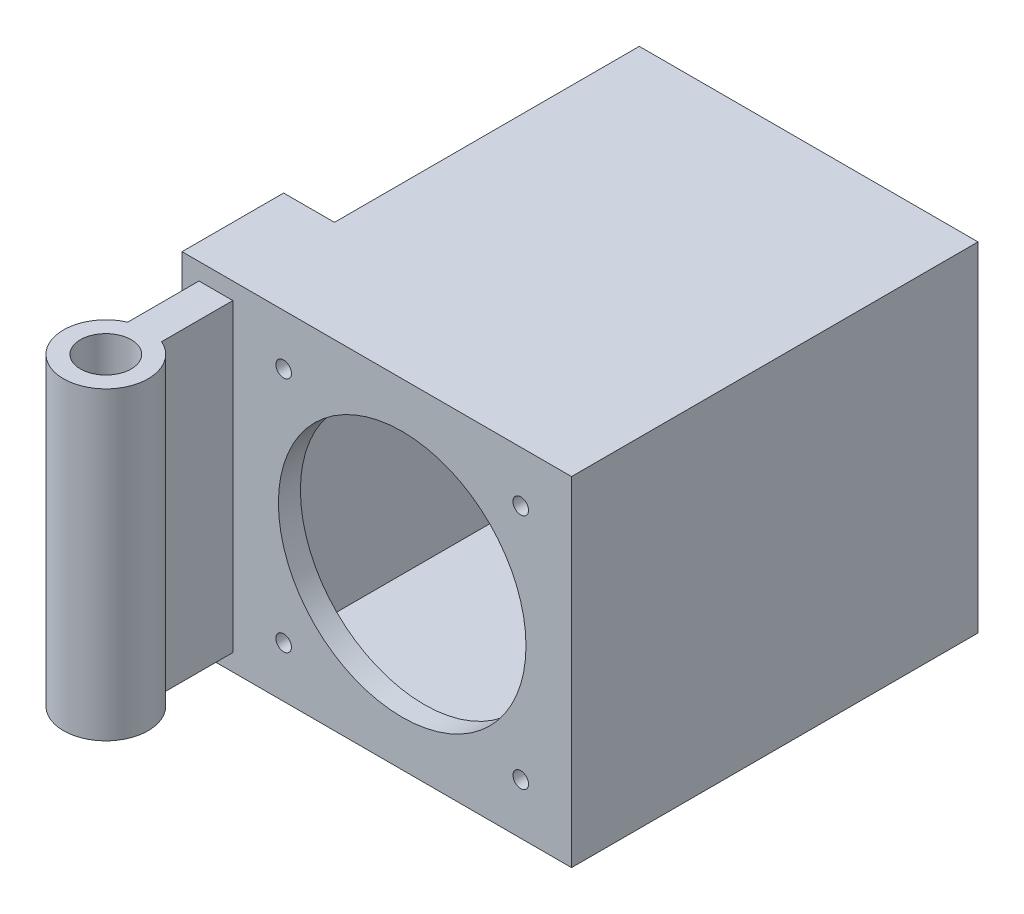
ISO-10303-21;
HEADER;
FILE_DESCRIPTION(('STEP AP214'),'2;1');
FILE_NAME('part.step','',(''),(''),'','','');
FILE_SCHEMA(('AUTOMOTIVE_DESIGN { 1 0 10303 214 1 1 1 1 }'));
ENDSEC;
DATA;
#1=APPLICATION_CONTEXT('core data for automotive mechanical design processes');
#2=APPLICATION_PROTOCOL_DEFINITION('international standard','automotive_design',2000,#1);
#3=PRODUCT_CONTEXT('',#1,'mechanical');
#4=PRODUCT('Part','Part','',(#3));
#5=PRODUCT_RELATED_PRODUCT_CATEGORY('part','',(#4));
#6=PRODUCT_DEFINITION_FORMATION('','',#4);
#7=PRODUCT_DEFINITION_CONTEXT('part definition',#1,'design');
#8=PRODUCT_DEFINITION('design','',#6,#7);
#9=PRODUCT_DEFINITION_SHAPE('','',#8);
#10=(LENGTH_UNIT() NAMED_UNIT(*) SI_UNIT(.MILLI.,.METRE.));
#11=(NAMED_UNIT(*) PLANE_ANGLE_UNIT() SI_UNIT($,.RADIAN.));
#12=(NAMED_UNIT(*) SI_UNIT($,.STERADIAN.) SOLID_ANGLE_UNIT());
#13=UNCERTAINTY_MEASURE_WITH_UNIT(LENGTH_MEASURE(1.E-05),#10,'distance_accuracy_value','');
#14=(GEOMETRIC_REPRESENTATION_CONTEXT(3) GLOBAL_UNCERTAINTY_ASSIGNED_CONTEXT((#13)) GLOBAL_UNIT_ASSIGNED_CONTEXT((#10,
#11,#12)) REPRESENTATION_CONTEXT('',''));
#15=CARTESIAN_POINT('',(0.,0.,0.));
#16=DIRECTION('',(0.,0.,1.));
#17=DIRECTION('',(1.,0.,0.));
#18=AXIS2_PLACEMENT_3D('',#15,#16,#17);
#19=CARTESIAN_POINT('',(0.,0.,60.));
#20=DIRECTION('',(0.,0.,-1.));
#21=DIRECTION('',(-1.,0.,0.));
#22=AXIS2_PLACEMENT_3D('',#19,#20,#21);
#23=PLANE('',#22);
#24=DIRECTION('',(1.,0.,0.));
#25=VECTOR('',#24,1.);
#26=CARTESIAN_POINT('',(-50.,50.,60.));
#27=LINE('',#26,#25);
#28=CARTESIAN_POINT('',(-65.,50.,60.));
#29=VERTEX_POINT('',#28);
#30=CARTESIAN_POINT('',(50.,50.,60.));
#31=VERTEX_POINT('',#30);
#32=EDGE_CURVE('E259',#29,#31,#27,.T.);
#33=ORIENTED_EDGE('',*,*,#32,.F.);
#34=DIRECTION('',(0.,1.,0.));
#35=VECTOR('',#34,1.);
#36=CARTESIAN_POINT('',(-65.,-50.,60.));
#37=LINE('',#36,#35);
#38=CARTESIAN_POINT('',(-65.,-50.,60.));
#39=VERTEX_POINT('',#38);
#40=EDGE_CURVE('E182',#39,#29,#37,.T.);
#41=ORIENTED_EDGE('',*,*,#40,.F.);
#42=DIRECTION('',(1.,0.,0.));
#43=VECTOR('',#42,1.);
#44=CARTESIAN_POINT('',(-50.,-50.,60.));
#45=LINE('',#44,#43);
#46=CARTESIAN_POINT('',(50.,-50.,60.));
#47=VERTEX_POINT('',#46);
#48=EDGE_CURVE('E265',#39,#47,#45,.T.);
#49=ORIENTED_EDGE('',*,*,#48,.T.);
#50=DIRECTION('',(0.,1.,0.));
#51=VECTOR('',#50,1.);
#52=CARTESIAN_POINT('',(50.,-50.,60.));
#53=LINE('',#52,#51);
#54=EDGE_CURVE('E262',#47,#31,#53,.T.);
#55=ORIENTED_EDGE('',*,*,#54,.T.);
#56=EDGE_LOOP('',(#33,#41,#49,#55));
#57=FACE_BOUND('',#56,.T.);
#58=CARTESIAN_POINT('',(0.,0.,60.));
#59=DIRECTION('',(0.,0.,1.));
#60=DIRECTION('',(1.,0.,0.));
#61=AXIS2_PLACEMENT_3D('',#58,#59,#60);
#62=CIRCLE('',#61,36.55);
#63=CARTESIAN_POINT('',(36.55,0.,60.));
#64=VERTEX_POINT('',#63);
#65=EDGE_CURVE('E224',#64,#64,#62,.T.);
#66=ORIENTED_EDGE('',*,*,#65,.F.);
#67=EDGE_LOOP('',(#66));
#68=FACE_BOUND('',#67,.T.);
#69=CARTESIAN_POINT('',(-35.,35.,60.));
#70=DIRECTION('',(0.,0.,1.));
#71=DIRECTION('',(1.,0.,0.));
#72=AXIS2_PLACEMENT_3D('',#69,#70,#71);
#73=CIRCLE('',#72,2.29999999999999);
#74=CARTESIAN_POINT('',(-32.7,35.,60.));
#75=VERTEX_POINT('',#74);
#76=EDGE_CURVE('E218',#75,#75,#73,.T.);
#77=ORIENTED_EDGE('',*,*,#76,.F.);
#78=EDGE_LOOP('',(#77));
#79=FACE_BOUND('',#78,.T.);
#80=CARTESIAN_POINT('',(-34.9999999999999,-35.0000000000001,60.));
#81=DIRECTION('',(0.,0.,1.));
#82=DIRECTION('',(1.,0.,0.));
#83=AXIS2_PLACEMENT_3D('',#80,#81,#82);
#84=CIRCLE('',#83,2.29999999999999);
#85=CARTESIAN_POINT('',(-32.6999999999999,-35.0000000000001,60.));
#86=VERTEX_POINT('',#85);
#87=EDGE_CURVE('E212',#86,#86,#84,.T.);
#88=ORIENTED_EDGE('',*,*,#87,.F.);
#89=EDGE_LOOP('',(#88));
#90=FACE_BOUND('',#89,.T.);
#91=CARTESIAN_POINT('',(35.,-35.,60.));
#92=DIRECTION('',(0.,0.,1.));
#93=DIRECTION('',(1.,0.,0.));
#94=AXIS2_PLACEMENT_3D('',#91,#92,#93);
#95=CIRCLE('',#94,2.29999999999999);
#96=CARTESIAN_POINT('',(37.3,-35.,60.));
#97=VERTEX_POINT('',#96);
#98=EDGE_CURVE('E206',#97,#97,#95,.T.);
#99=ORIENTED_EDGE('',*,*,#98,.F.);
#100=EDGE_LOOP('',(#99));
#101=FACE_BOUND('',#100,.T.);
#102=CARTESIAN_POINT('',(34.9999999999996,35.0000000000004,60.));
#103=DIRECTION('',(0.,0.,1.));
#104=DIRECTION('',(1.,0.,0.));
#105=AXIS2_PLACEMENT_3D('',#102,#103,#104);
#106=CIRCLE('',#105,2.29999999999999);
#107=CARTESIAN_POINT('',(37.2999999999996,35.0000000000004,60.));
#108=VERTEX_POINT('',#107);
#109=EDGE_CURVE('E200',#108,#108,#106,.T.);
#110=ORIENTED_EDGE('',*,*,#109,.F.);
#111=EDGE_LOOP('',(#110));
#112=FACE_BOUND('',#111,.T.);
#113=DIRECTION('',(0.,1.,0.));
#114=VECTOR('',#113,1.);
#115=CARTESIAN_POINT('',(-50.,-45.,60.));
#116=LINE('',#115,#114);
#117=CARTESIAN_POINT('',(-50.,-45.,60.));
#118=VERTEX_POINT('',#117);
#119=CARTESIAN_POINT('',(-50.,45.,60.));
#120=VERTEX_POINT('',#119);
#121=EDGE_CURVE('E149',#118,#120,#116,.T.);
#122=ORIENTED_EDGE('',*,*,#121,.F.);
#123=DIRECTION('',(1.,0.,0.));
#124=VECTOR('',#123,1.);
#125=CARTESIAN_POINT('',(-60.,-45.,60.));
#126=LINE('',#125,#124);
#127=CARTESIAN_POINT('',(-60.,-45.,60.));
#128=VERTEX_POINT('',#127);
#129=EDGE_CURVE('E146',#128,#118,#126,.T.);
#130=ORIENTED_EDGE('',*,*,#129,.F.);
#131=DIRECTION('',(0.,-1.,0.));
#132=VECTOR('',#131,1.);
#133=CARTESIAN_POINT('',(-60.,-45.,60.));
#134=LINE('',#133,#132);
#135=CARTESIAN_POINT('',(-60.,45.,60.));
#136=VERTEX_POINT('',#135);
#137=EDGE_CURVE('E60',#136,#128,#134,.T.);
#138=ORIENTED_EDGE('',*,*,#137,.F.);
#139=DIRECTION('',(-1.,0.,0.));
#140=VECTOR('',#139,1.);
#141=CARTESIAN_POINT('',(-60.,45.,60.));
#142=LINE('',#141,#140);
#143=EDGE_CURVE('E55',#120,#136,#142,.T.);
#144=ORIENTED_EDGE('',*,*,#143,.F.);
#145=EDGE_LOOP('',(#122,#130,#138,#144));
#146=FACE_BOUND('',#145,.T.);
#147=ADVANCED_FACE('F38',(#57,#68,#79,#90,#101,#112,#146),#23,.F.);
#148=CARTESIAN_POINT('',(0.,0.,53.5));
#149=DIRECTION('',(0.,0.,-1.));
#150=DIRECTION('',(-1.,0.,0.));
#151=AXIS2_PLACEMENT_3D('',#148,#149,#150);
#152=PLANE('',#151);
#153=CARTESIAN_POINT('',(34.9999999999996,35.0000000000004,53.5));
#154=DIRECTION('',(0.,0.,-1.));
#155=DIRECTION('',(-1.,0.,0.));
#156=AXIS2_PLACEMENT_3D('',#153,#154,#155);
#157=CIRCLE('',#156,2.29999999999999);
#158=CARTESIAN_POINT('',(32.6999999999996,35.0000000000004,53.5));
#159=VERTEX_POINT('',#158);
#160=EDGE_CURVE('E203',#159,#159,#157,.F.);
#161=ORIENTED_EDGE('',*,*,#160,.T.);
#162=EDGE_LOOP('',(#161));
#163=FACE_BOUND('',#162,.T.);
#164=CARTESIAN_POINT('',(-34.9999999999999,-35.0000000000001,53.5));
#165=DIRECTION('',(0.,0.,-1.));
#166=DIRECTION('',(-1.,0.,0.));
#167=AXIS2_PLACEMENT_3D('',#164,#165,#166);
#168=CIRCLE('',#167,2.29999999999999);
#169=CARTESIAN_POINT('',(-37.2999999999999,-35.0000000000001,53.5));
#170=VERTEX_POINT('',#169);
#171=EDGE_CURVE('E215',#170,#170,#168,.F.);
#172=ORIENTED_EDGE('',*,*,#171,.T.);
#173=EDGE_LOOP('',(#172));
#174=FACE_BOUND('',#173,.T.);
#175=DIRECTION('',(0.,-1.,0.));
#176=VECTOR('',#175,1.);
#177=CARTESIAN_POINT('',(-43.5,-43.5,53.5));
#178=LINE('',#177,#176);
#179=CARTESIAN_POINT('',(-43.5,43.5,53.5));
#180=VERTEX_POINT('',#179);
#181=CARTESIAN_POINT('',(-43.5,-43.5,53.5));
#182=VERTEX_POINT('',#181);
#183=EDGE_CURVE('E236',#180,#182,#178,.T.);
#184=ORIENTED_EDGE('',*,*,#183,.F.);
#185=DIRECTION('',(-1.,0.,0.));
#186=VECTOR('',#185,1.);
#187=CARTESIAN_POINT('',(43.5,43.5,53.5));
#188=LINE('',#187,#186);
#189=CARTESIAN_POINT('',(43.5,43.5,53.5));
#190=VERTEX_POINT('',#189);
#191=EDGE_CURVE('E238',#190,#180,#188,.T.);
#192=ORIENTED_EDGE('',*,*,#191,.F.);
#193=DIRECTION('',(0.,1.,0.));
#194=VECTOR('',#193,1.);
#195=CARTESIAN_POINT('',(43.5,-43.5,53.5));
#196=LINE('',#195,#194);
#197=CARTESIAN_POINT('',(43.5,-43.5,53.5));
#198=VERTEX_POINT('',#197);
#199=EDGE_CURVE('E231',#198,#190,#196,.T.);
#200=ORIENTED_EDGE('',*,*,#199,.F.);
#201=DIRECTION('',(1.,0.,0.));
#202=VECTOR('',#201,1.);
#203=CARTESIAN_POINT('',(43.5,-43.5,53.5));
#204=LINE('',#203,#202);
#205=EDGE_CURVE('E233',#182,#198,#204,.T.);
#206=ORIENTED_EDGE('',*,*,#205,.F.);
#207=EDGE_LOOP('',(#184,#192,#200,#206));
#208=FACE_BOUND('',#207,.T.);
#209=CARTESIAN_POINT('',(0.,0.,53.5));
#210=DIRECTION('',(0.,0.,-1.));
#211=DIRECTION('',(-1.,0.,0.));
#212=AXIS2_PLACEMENT_3D('',#209,#210,#211);
#213=CIRCLE('',#212,36.55);
#214=CARTESIAN_POINT('',(-36.55,0.,53.5));
#215=VERTEX_POINT('',#214);
#216=EDGE_CURVE('E227',#215,#215,#213,.F.);
#217=ORIENTED_EDGE('',*,*,#216,.T.);
#218=EDGE_LOOP('',(#217));
#219=FACE_BOUND('',#218,.T.);
#220=CARTESIAN_POINT('',(-35.,35.,53.5));
#221=DIRECTION('',(0.,0.,-1.));
#222=DIRECTION('',(-1.,0.,0.));
#223=AXIS2_PLACEMENT_3D('',#220,#221,#222);
#224=CIRCLE('',#223,2.29999999999999);
#225=CARTESIAN_POINT('',(-37.3,35.,53.5));
#226=VERTEX_POINT('',#225);
#227=EDGE_CURVE('E221',#226,#226,#224,.F.);
#228=ORIENTED_EDGE('',*,*,#227,.T.);
#229=EDGE_LOOP('',(#228));
#230=FACE_BOUND('',#229,.T.);
#231=CARTESIAN_POINT('',(35.,-35.,53.5));
#232=DIRECTION('',(0.,0.,-1.));
#233=DIRECTION('',(-1.,0.,0.));
#234=AXIS2_PLACEMENT_3D('',#231,#232,#233);
#235=CIRCLE('',#234,2.29999999999999);
#236=CARTESIAN_POINT('',(32.7,-35.,53.5));
#237=VERTEX_POINT('',#236);
#238=EDGE_CURVE('E209',#237,#237,#235,.F.);
#239=ORIENTED_EDGE('',*,*,#238,.T.);
#240=EDGE_LOOP('',(#239));
#241=FACE_BOUND('',#240,.T.);
#242=ADVANCED_FACE('F319',(#163,#174,#208,#219,#230,#241),#152,.T.);
#243=CARTESIAN_POINT('',(-50.,-50.,60.));
#244=DIRECTION('',(-1.,0.,0.));
#245=DIRECTION('',(0.,0.,1.));
#246=AXIS2_PLACEMENT_3D('',#243,#244,#245);
#247=PLANE('',#246);
#248=DIRECTION('',(0.,-1.,0.));
#249=VECTOR('',#248,1.);
#250=CARTESIAN_POINT('',(-50.,-50.,30.));
#251=LINE('',#250,#249);
#252=CARTESIAN_POINT('',(-50.,50.,30.));
#253=VERTEX_POINT('',#252);
#254=CARTESIAN_POINT('',(-50.,-50.,30.));
#255=VERTEX_POINT('',#254);
#256=EDGE_CURVE('E179',#253,#255,#251,.T.);
#257=ORIENTED_EDGE('',*,*,#256,.F.);
#258=DIRECTION('',(0.,0.,-1.));
#259=VECTOR('',#258,1.);
#260=CARTESIAN_POINT('',(-50.,50.,60.));
#261=LINE('',#260,#259);
#262=CARTESIAN_POINT('',(-50.,50.,-60.));
#263=VERTEX_POINT('',#262);
#264=EDGE_CURVE('E42',#253,#263,#261,.T.);
#265=ORIENTED_EDGE('',*,*,#264,.T.);
#266=DIRECTION('',(0.,1.,0.));
#267=VECTOR('',#266,1.);
#268=CARTESIAN_POINT('',(-50.,-50.,-60.));
#269=LINE('',#268,#267);
#270=CARTESIAN_POINT('',(-50.,-50.,-60.));
#271=VERTEX_POINT('',#270);
#272=EDGE_CURVE('E258',#271,#263,#269,.T.);
#273=ORIENTED_EDGE('',*,*,#272,.F.);
#274=DIRECTION('',(0.,0.,-1.));
#275=VECTOR('',#274,1.);
#276=CARTESIAN_POINT('',(-50.,-50.,60.));
#277=LINE('',#276,#275);
#278=EDGE_CURVE('E12',#255,#271,#277,.T.);
#279=ORIENTED_EDGE('',*,*,#278,.F.);
#280=EDGE_LOOP('',(#257,#265,#273,#279));
#281=FACE_BOUND('',#280,.T.);
#282=ADVANCED_FACE('F40',(#281),#247,.T.);
#283=CARTESIAN_POINT('',(-50.,-50.,60.));
#284=DIRECTION('',(0.,1.,0.));
#285=DIRECTION('',(0.,0.,1.));
#286=AXIS2_PLACEMENT_3D('',#283,#284,#285);
#287=PLANE('',#286);
#288=DIRECTION('',(1.,0.,0.));
#289=VECTOR('',#288,1.);
#290=CARTESIAN_POINT('',(-50.,-50.,-60.));
#291=LINE('',#290,#289);
#292=CARTESIAN_POINT('',(50.,-50.,-60.));
#293=VERTEX_POINT('',#292);
#294=EDGE_CURVE('E263',#271,#293,#291,.T.);
#295=ORIENTED_EDGE('',*,*,#294,.T.);
#296=DIRECTION('',(0.,0.,-1.));
#297=VECTOR('',#296,1.);
#298=CARTESIAN_POINT('',(50.,-50.,60.));
#299=LINE('',#298,#297);
#300=EDGE_CURVE('E47',#47,#293,#299,.T.);
#301=ORIENTED_EDGE('',*,*,#300,.F.);
#302=ORIENTED_EDGE('',*,*,#48,.F.);
#303=DIRECTION('',(0.,0.,1.));
#304=VECTOR('',#303,1.);
#305=CARTESIAN_POINT('',(-65.,-50.,30.));
#306=LINE('',#305,#304);
#307=CARTESIAN_POINT('',(-65.,-50.,30.));
#308=VERTEX_POINT('',#307);
#309=EDGE_CURVE('E189',#308,#39,#306,.T.);
#310=ORIENTED_EDGE('',*,*,#309,.F.);
#311=DIRECTION('',(1.,0.,0.));
#312=VECTOR('',#311,1.);
#313=CARTESIAN_POINT('',(-65.,-50.,30.));
#314=LINE('',#313,#312);
#315=EDGE_CURVE('E192',#308,#255,#314,.T.);
#316=ORIENTED_EDGE('',*,*,#315,.T.);
#317=ORIENTED_EDGE('',*,*,#278,.T.);
#318=EDGE_LOOP('',(#295,#301,#302,#310,#316,#317));
#319=FACE_BOUND('',#318,.T.);
#320=ADVANCED_FACE('F292',(#319),#287,.F.);
#321=CARTESIAN_POINT('',(50.,-50.,60.));
#322=DIRECTION('',(-1.,0.,0.));
#323=DIRECTION('',(0.,0.,1.));
#324=AXIS2_PLACEMENT_3D('',#321,#322,#323);
#325=PLANE('',#324);
#326=DIRECTION('',(0.,1.,0.));
#327=VECTOR('',#326,1.);
#328=CARTESIAN_POINT('',(50.,-50.,-60.));
#329=LINE('',#328,#327);
#330=CARTESIAN_POINT('',(50.,50.,-60.));
#331=VERTEX_POINT('',#330);
#332=EDGE_CURVE('E272',#293,#331,#329,.T.);
#333=ORIENTED_EDGE('',*,*,#332,.T.);
#334=DIRECTION('',(0.,0.,-1.));
#335=VECTOR('',#334,1.);
#336=CARTESIAN_POINT('',(50.,50.,60.));
#337=LINE('',#336,#335);
#338=EDGE_CURVE('E277',#31,#331,#337,.T.);
#339=ORIENTED_EDGE('',*,*,#338,.F.);
#340=ORIENTED_EDGE('',*,*,#54,.F.);
#341=ORIENTED_EDGE('',*,*,#300,.T.);
#342=EDGE_LOOP('',(#333,#339,#340,#341));
#343=FACE_BOUND('',#342,.T.);
#344=ADVANCED_FACE('F295',(#343),#325,.F.);
#345=CARTESIAN_POINT('',(-50.,50.,60.));
#346=DIRECTION('',(0.,1.,0.));
#347=DIRECTION('',(0.,0.,1.));
#348=AXIS2_PLACEMENT_3D('',#345,#346,#347);
#349=PLANE('',#348);
#350=DIRECTION('',(1.,0.,0.));
#351=VECTOR('',#350,1.);
#352=CARTESIAN_POINT('',(-50.,50.,-60.));
#353=LINE('',#352,#351);
#354=EDGE_CURVE('E269',#263,#331,#353,.T.);
#355=ORIENTED_EDGE('',*,*,#354,.F.);
#356=ORIENTED_EDGE('',*,*,#264,.F.);
#357=DIRECTION('',(1.,0.,0.));
#358=VECTOR('',#357,1.);
#359=CARTESIAN_POINT('',(-65.,50.,30.));
#360=LINE('',#359,#358);
#361=CARTESIAN_POINT('',(-65.,50.,30.));
#362=VERTEX_POINT('',#361);
#363=EDGE_CURVE('E197',#362,#253,#360,.T.);
#364=ORIENTED_EDGE('',*,*,#363,.F.);
#365=DIRECTION('',(0.,0.,-1.));
#366=VECTOR('',#365,1.);
#367=CARTESIAN_POINT('',(-65.,50.,30.));
#368=LINE('',#367,#366);
#369=EDGE_CURVE('E185',#29,#362,#368,.T.);
#370=ORIENTED_EDGE('',*,*,#369,.F.);
#371=ORIENTED_EDGE('',*,*,#32,.T.);
#372=ORIENTED_EDGE('',*,*,#338,.T.);
#373=EDGE_LOOP('',(#355,#356,#364,#370,#371,#372));
#374=FACE_BOUND('',#373,.T.);
#375=ADVANCED_FACE('F285',(#374),#349,.T.);
#376=CARTESIAN_POINT('',(0.,0.,-60.));
#377=DIRECTION('',(0.,0.,-1.));
#378=DIRECTION('',(-1.,0.,0.));
#379=AXIS2_PLACEMENT_3D('',#376,#377,#378);
#380=PLANE('',#379);
#381=DIRECTION('',(0.,1.,0.));
#382=VECTOR('',#381,1.);
#383=CARTESIAN_POINT('',(-43.5,-43.5,-60.));
#384=LINE('',#383,#382);
#385=CARTESIAN_POINT('',(-43.5,-43.5,-60.));
#386=VERTEX_POINT('',#385);
#387=CARTESIAN_POINT('',(-43.5,43.5,-60.));
#388=VERTEX_POINT('',#387);
#389=EDGE_CURVE('E230',#386,#388,#384,.T.);
#390=ORIENTED_EDGE('',*,*,#389,.F.);
#391=DIRECTION('',(-1.,0.,0.));
#392=VECTOR('',#391,1.);
#393=CARTESIAN_POINT('',(43.5,-43.5,-60.));
#394=LINE('',#393,#392);
#395=CARTESIAN_POINT('',(43.5,-43.5,-60.));
#396=VERTEX_POINT('',#395);
#397=EDGE_CURVE('E246',#396,#386,#394,.T.);
#398=ORIENTED_EDGE('',*,*,#397,.F.);
#399=DIRECTION('',(0.,-1.,0.));
#400=VECTOR('',#399,1.);
#401=CARTESIAN_POINT('',(43.5,-43.5,-60.));
#402=LINE('',#401,#400);
#403=CARTESIAN_POINT('',(43.5,43.5,-60.));
#404=VERTEX_POINT('',#403);
#405=EDGE_CURVE('E243',#404,#396,#402,.T.);
#406=ORIENTED_EDGE('',*,*,#405,.F.);
#407=DIRECTION('',(1.,0.,0.));
#408=VECTOR('',#407,1.);
#409=CARTESIAN_POINT('',(43.5,43.5,-60.));
#410=LINE('',#409,#408);
#411=EDGE_CURVE('E240',#388,#404,#410,.T.);
#412=ORIENTED_EDGE('',*,*,#411,.F.);
#413=EDGE_LOOP('',(#390,#398,#406,#412));
#414=FACE_BOUND('',#413,.T.);
#415=ORIENTED_EDGE('',*,*,#272,.T.);
#416=ORIENTED_EDGE('',*,*,#354,.T.);
#417=ORIENTED_EDGE('',*,*,#332,.F.);
#418=ORIENTED_EDGE('',*,*,#294,.F.);
#419=EDGE_LOOP('',(#415,#416,#417,#418));
#420=FACE_BOUND('',#419,.T.);
#421=ADVANCED_FACE('F289',(#414,#420),#380,.T.);
#422=CARTESIAN_POINT('',(-43.5,-43.5,183.036579926459));
#423=DIRECTION('',(-1.,0.,0.));
#424=DIRECTION('',(0.,0.,1.));
#425=AXIS2_PLACEMENT_3D('',#422,#423,#424);
#426=PLANE('',#425);
#427=ORIENTED_EDGE('',*,*,#183,.T.);
#428=DIRECTION('',(0.,0.,-1.));
#429=VECTOR('',#428,1.);
#430=CARTESIAN_POINT('',(-43.5,-43.5,183.036579926459));
#431=LINE('',#430,#429);
#432=EDGE_CURVE('E234',#182,#386,#431,.T.);
#433=ORIENTED_EDGE('',*,*,#432,.T.);
#434=ORIENTED_EDGE('',*,*,#389,.T.);
#435=DIRECTION('',(0.,0.,-1.));
#436=VECTOR('',#435,1.);
#437=CARTESIAN_POINT('',(-43.5,43.5,183.036579926459));
#438=LINE('',#437,#436);
#439=EDGE_CURVE('E249',#180,#388,#438,.T.);
#440=ORIENTED_EDGE('',*,*,#439,.F.);
#441=EDGE_LOOP('',(#427,#433,#434,#440));
#442=FACE_BOUND('',#441,.T.);
#443=ADVANCED_FACE('F328',(#442),#426,.F.);
#444=CARTESIAN_POINT('',(43.5,-43.5,183.036579926459));
#445=DIRECTION('',(0.,-1.,0.));
#446=DIRECTION('',(0.,0.,-1.));
#447=AXIS2_PLACEMENT_3D('',#444,#445,#446);
#448=PLANE('',#447);
#449=ORIENTED_EDGE('',*,*,#205,.T.);
#450=DIRECTION('',(0.,0.,-1.));
#451=VECTOR('',#450,1.);
#452=CARTESIAN_POINT('',(43.5,-43.5,183.036579926459));
#453=LINE('',#452,#451);
#454=EDGE_CURVE('E251',#198,#396,#453,.T.);
#455=ORIENTED_EDGE('',*,*,#454,.T.);
#456=ORIENTED_EDGE('',*,*,#397,.T.);
#457=ORIENTED_EDGE('',*,*,#432,.F.);
#458=EDGE_LOOP('',(#449,#455,#456,#457));
#459=FACE_BOUND('',#458,.T.);
#460=ADVANCED_FACE('F352',(#459),#448,.F.);
#461=CARTESIAN_POINT('',(43.5,-43.5,183.036579926459));
#462=DIRECTION('',(1.,0.,0.));
#463=DIRECTION('',(0.,0.,-1.));
#464=AXIS2_PLACEMENT_3D('',#461,#462,#463);
#465=PLANE('',#464);
#466=ORIENTED_EDGE('',*,*,#199,.T.);
#467=DIRECTION('',(0.,0.,-1.));
#468=VECTOR('',#467,1.);
#469=CARTESIAN_POINT('',(43.5,43.5,183.036579926459));
#470=LINE('',#469,#468);
#471=EDGE_CURVE('E253',#190,#404,#470,.T.);
#472=ORIENTED_EDGE('',*,*,#471,.T.);
#473=ORIENTED_EDGE('',*,*,#405,.T.);
#474=ORIENTED_EDGE('',*,*,#454,.F.);
#475=EDGE_LOOP('',(#466,#472,#473,#474));
#476=FACE_BOUND('',#475,.T.);
#477=ADVANCED_FACE('F359',(#476),#465,.F.);
#478=CARTESIAN_POINT('',(43.5,43.5,183.036579926459));
#479=DIRECTION('',(0.,1.,0.));
#480=DIRECTION('',(0.,0.,1.));
#481=AXIS2_PLACEMENT_3D('',#478,#479,#480);
#482=PLANE('',#481);
#483=ORIENTED_EDGE('',*,*,#191,.T.);
#484=ORIENTED_EDGE('',*,*,#439,.T.);
#485=ORIENTED_EDGE('',*,*,#411,.T.);
#486=ORIENTED_EDGE('',*,*,#471,.F.);
#487=EDGE_LOOP('',(#483,#484,#485,#486));
#488=FACE_BOUND('',#487,.T.);
#489=ADVANCED_FACE('F367',(#488),#482,.F.);
#490=CARTESIAN_POINT('',(0.,0.,-49.8790114094732));
#491=DIRECTION('',(0.,0.,1.));
#492=DIRECTION('',(1.,0.,0.));
#493=AXIS2_PLACEMENT_3D('',#490,#491,#492);
#494=CYLINDRICAL_SURFACE('',#493,36.55);
#495=ORIENTED_EDGE('',*,*,#65,.T.);
#496=EDGE_LOOP('',(#495));
#497=FACE_BOUND('',#496,.T.);
#498=ORIENTED_EDGE('',*,*,#216,.F.);
#499=EDGE_LOOP('',(#498));
#500=FACE_BOUND('',#499,.T.);
#501=ADVANCED_FACE('F375',(#497,#500),#494,.F.);
#502=CARTESIAN_POINT('',(-35.,35.,60.));
#503=DIRECTION('',(0.,0.,1.));
#504=DIRECTION('',(1.,0.,0.));
#505=AXIS2_PLACEMENT_3D('',#502,#503,#504);
#506=CYLINDRICAL_SURFACE('',#505,2.29999999999999);
#507=ORIENTED_EDGE('',*,*,#227,.F.);
#508=EDGE_LOOP('',(#507));
#509=FACE_BOUND('',#508,.T.);
#510=ORIENTED_EDGE('',*,*,#76,.T.);
#511=EDGE_LOOP('',(#510));
#512=FACE_BOUND('',#511,.T.);
#513=ADVANCED_FACE('F382',(#509,#512),#506,.F.);
#514=CARTESIAN_POINT('',(-34.9999999999999,-35.0000000000001,60.));
#515=DIRECTION('',(0.,0.,1.));
#516=DIRECTION('',(1.,0.,0.));
#517=AXIS2_PLACEMENT_3D('',#514,#515,#516);
#518=CYLINDRICAL_SURFACE('',#517,2.29999999999999);
#519=ORIENTED_EDGE('',*,*,#171,.F.);
#520=EDGE_LOOP('',(#519));
#521=FACE_BOUND('',#520,.T.);
#522=ORIENTED_EDGE('',*,*,#87,.T.);
#523=EDGE_LOOP('',(#522));
#524=FACE_BOUND('',#523,.T.);
#525=ADVANCED_FACE('F390',(#521,#524),#518,.F.);
#526=CARTESIAN_POINT('',(35.,-35.,60.));
#527=DIRECTION('',(0.,0.,1.));
#528=DIRECTION('',(1.,0.,0.));
#529=AXIS2_PLACEMENT_3D('',#526,#527,#528);
#530=CYLINDRICAL_SURFACE('',#529,2.29999999999999);
#531=ORIENTED_EDGE('',*,*,#238,.F.);
#532=EDGE_LOOP('',(#531));
#533=FACE_BOUND('',#532,.T.);
#534=ORIENTED_EDGE('',*,*,#98,.T.);
#535=EDGE_LOOP('',(#534));
#536=FACE_BOUND('',#535,.T.);
#537=ADVANCED_FACE('F315',(#533,#536),#530,.F.);
#538=CARTESIAN_POINT('',(34.9999999999996,35.0000000000004,60.));
#539=DIRECTION('',(0.,0.,1.));
#540=DIRECTION('',(1.,0.,0.));
#541=AXIS2_PLACEMENT_3D('',#538,#539,#540);
#542=CYLINDRICAL_SURFACE('',#541,2.29999999999999);
#543=ORIENTED_EDGE('',*,*,#160,.F.);
#544=EDGE_LOOP('',(#543));
#545=FACE_BOUND('',#544,.T.);
#546=ORIENTED_EDGE('',*,*,#109,.T.);
#547=EDGE_LOOP('',(#546));
#548=FACE_BOUND('',#547,.T.);
#549=ADVANCED_FACE('F308',(#545,#548),#542,.F.);
#550=CARTESIAN_POINT('',(-65.,-50.,30.));
#551=DIRECTION('',(0.,0.,1.));
#552=DIRECTION('',(1.,0.,0.));
#553=AXIS2_PLACEMENT_3D('',#550,#551,#552);
#554=PLANE('',#553);
#555=ORIENTED_EDGE('',*,*,#256,.T.);
#556=ORIENTED_EDGE('',*,*,#315,.F.);
#557=DIRECTION('',(0.,-1.,0.));
#558=VECTOR('',#557,1.);
#559=CARTESIAN_POINT('',(-65.,-50.,30.));
#560=LINE('',#559,#558);
#561=EDGE_CURVE('E187',#362,#308,#560,.T.);
#562=ORIENTED_EDGE('',*,*,#561,.F.);
#563=ORIENTED_EDGE('',*,*,#363,.T.);
#564=EDGE_LOOP('',(#555,#556,#562,#563));
#565=FACE_BOUND('',#564,.T.);
#566=ADVANCED_FACE('F306',(#565),#554,.F.);
#567=CARTESIAN_POINT('',(-65.,0.,0.));
#568=DIRECTION('',(1.,0.,0.));
#569=DIRECTION('',(0.,0.,-1.));
#570=AXIS2_PLACEMENT_3D('',#567,#568,#569);
#571=PLANE('',#570);
#572=ORIENTED_EDGE('',*,*,#40,.T.);
#573=ORIENTED_EDGE('',*,*,#369,.T.);
#574=ORIENTED_EDGE('',*,*,#561,.T.);
#575=ORIENTED_EDGE('',*,*,#309,.T.);
#576=EDGE_LOOP('',(#572,#573,#574,#575));
#577=FACE_BOUND('',#576,.T.);
#578=ADVANCED_FACE('F302',(#577),#571,.F.);
#579=CARTESIAN_POINT('',(-50.,-45.,105.001));
#580=DIRECTION('',(-1.,0.,0.));
#581=DIRECTION('',(0.,0.,1.));
#582=AXIS2_PLACEMENT_3D('',#579,#580,#581);
#583=PLANE('',#582);
#584=DIRECTION('',(0.,-1.,0.));
#585=VECTOR('',#584,1.);
#586=CARTESIAN_POINT('',(-50.,85.3553390593274,81.0435607626104));
#587=LINE('',#586,#585);
#588=CARTESIAN_POINT('',(-50.,-45.,81.0435607626104));
#589=VERTEX_POINT('',#588);
#590=CARTESIAN_POINT('',(-50.,45.,81.0435607626104));
#591=VERTEX_POINT('',#590);
#592=EDGE_CURVE('E153',#589,#591,#587,.F.);
#593=ORIENTED_EDGE('',*,*,#592,.F.);
#594=DIRECTION('',(0.,0.,-1.));
#595=VECTOR('',#594,1.);
#596=CARTESIAN_POINT('',(-50.,-45.,105.001));
#597=LINE('',#596,#595);
#598=EDGE_CURVE('E140',#589,#118,#597,.T.);
#599=ORIENTED_EDGE('',*,*,#598,.T.);
#600=ORIENTED_EDGE('',*,*,#121,.T.);
#601=DIRECTION('',(0.,0.,-1.));
#602=VECTOR('',#601,1.);
#603=CARTESIAN_POINT('',(-50.,45.,105.001));
#604=LINE('',#603,#602);
#605=EDGE_CURVE('E155',#591,#120,#604,.T.);
#606=ORIENTED_EDGE('',*,*,#605,.F.);
#607=EDGE_LOOP('',(#593,#599,#600,#606));
#608=FACE_BOUND('',#607,.T.);
#609=ADVANCED_FACE('F154',(#608),#583,.F.);
#610=CARTESIAN_POINT('',(-60.,45.,105.001));
#611=DIRECTION('',(0.,-1.,0.));
#612=DIRECTION('',(0.,0.,-1.));
#613=AXIS2_PLACEMENT_3D('',#610,#611,#612);
#614=PLANE('',#613);
#615=CARTESIAN_POINT('',(-55.,45.,92.5));
#616=DIRECTION('',(0.,1.,0.));
#617=DIRECTION('',(0.,0.,1.));
#618=AXIS2_PLACEMENT_3D('',#615,#616,#617);
#619=CIRCLE('',#618,7.5);
#620=CARTESIAN_POINT('',(-55.,45.,100.));
#621=VERTEX_POINT('',#620);
#622=EDGE_CURVE('E167',#621,#621,#619,.T.);
#623=ORIENTED_EDGE('',*,*,#622,.F.);
#624=EDGE_LOOP('',(#623));
#625=FACE_BOUND('',#624,.T.);
#626=DIRECTION('',(0.,0.,-1.));
#627=VECTOR('',#626,1.);
#628=CARTESIAN_POINT('',(-60.,45.,105.001));
#629=LINE('',#628,#627);
#630=CARTESIAN_POINT('',(-60.,45.,81.0435607626104));
#631=VERTEX_POINT('',#630);
#632=EDGE_CURVE('E174',#631,#136,#629,.T.);
#633=ORIENTED_EDGE('',*,*,#632,.F.);
#634=CARTESIAN_POINT('',(-55.,45.,92.5));
#635=DIRECTION('',(0.,1.,0.));
#636=DIRECTION('',(0.,0.,1.));
#637=AXIS2_PLACEMENT_3D('',#634,#635,#636);
#638=CIRCLE('',#637,12.5);
#639=EDGE_CURVE('E150',#631,#591,#638,.T.);
#640=ORIENTED_EDGE('',*,*,#639,.T.);
#641=ORIENTED_EDGE('',*,*,#605,.T.);
#642=ORIENTED_EDGE('',*,*,#143,.T.);
#643=EDGE_LOOP('',(#633,#640,#641,#642));
#644=FACE_BOUND('',#643,.T.);
#645=ADVANCED_FACE('F477',(#625,#644),#614,.F.);
#646=CARTESIAN_POINT('',(-60.,-45.,105.001));
#647=DIRECTION('',(1.,0.,0.));
#648=DIRECTION('',(0.,0.,-1.));
#649=AXIS2_PLACEMENT_3D('',#646,#647,#648);
#650=PLANE('',#649);
#651=DIRECTION('',(0.,-1.,0.));
#652=VECTOR('',#651,1.);
#653=CARTESIAN_POINT('',(-60.,85.3553390593274,81.0435607626104));
#654=LINE('',#653,#652);
#655=CARTESIAN_POINT('',(-60.,-45.,81.0435607626104));
#656=VERTEX_POINT('',#655);
#657=EDGE_CURVE('E159',#631,#656,#654,.T.);
#658=ORIENTED_EDGE('',*,*,#657,.F.);
#659=ORIENTED_EDGE('',*,*,#632,.T.);
#660=ORIENTED_EDGE('',*,*,#137,.T.);
#661=DIRECTION('',(0.,0.,-1.));
#662=VECTOR('',#661,1.);
#663=CARTESIAN_POINT('',(-60.,-45.,105.001));
#664=LINE('',#663,#662);
#665=EDGE_CURVE('E172',#656,#128,#664,.T.);
#666=ORIENTED_EDGE('',*,*,#665,.F.);
#667=EDGE_LOOP('',(#658,#659,#660,#666));
#668=FACE_BOUND('',#667,.T.);
#669=ADVANCED_FACE('F470',(#668),#650,.F.);
#670=CARTESIAN_POINT('',(-60.,-45.,105.001));
#671=DIRECTION('',(0.,1.,0.));
#672=DIRECTION('',(0.,0.,1.));
#673=AXIS2_PLACEMENT_3D('',#670,#671,#672);
#674=PLANE('',#673);
#675=CARTESIAN_POINT('',(-55.,-45.,92.5));
#676=DIRECTION('',(0.,1.,0.));
#677=DIRECTION('',(0.,0.,1.));
#678=AXIS2_PLACEMENT_3D('',#675,#676,#677);
#679=CIRCLE('',#678,7.5);
#680=CARTESIAN_POINT('',(-55.,-45.,100.));
#681=VERTEX_POINT('',#680);
#682=EDGE_CURVE('E163',#681,#681,#679,.F.);
#683=ORIENTED_EDGE('',*,*,#682,.F.);
#684=EDGE_LOOP('',(#683));
#685=FACE_BOUND('',#684,.T.);
#686=ORIENTED_EDGE('',*,*,#598,.F.);
#687=CARTESIAN_POINT('',(-55.,-45.,92.5));
#688=DIRECTION('',(0.,1.,0.));
#689=DIRECTION('',(0.,0.,1.));
#690=AXIS2_PLACEMENT_3D('',#687,#688,#689);
#691=CIRCLE('',#690,12.5);
#692=EDGE_CURVE('E145',#589,#656,#691,.F.);
#693=ORIENTED_EDGE('',*,*,#692,.T.);
#694=ORIENTED_EDGE('',*,*,#665,.T.);
#695=ORIENTED_EDGE('',*,*,#129,.T.);
#696=EDGE_LOOP('',(#686,#693,#694,#695));
#697=FACE_BOUND('',#696,.T.);
#698=ADVANCED_FACE('F142',(#685,#697),#674,.F.);
#699=CARTESIAN_POINT('',(-55.,85.3553390593274,92.5));
#700=DIRECTION('',(0.,-1.,0.));
#701=DIRECTION('',(0.,0.,-1.));
#702=AXIS2_PLACEMENT_3D('',#699,#700,#701);
#703=CYLINDRICAL_SURFACE('',#702,12.5);
#704=CARTESIAN_POINT('',(-67.2958326273579,0.,90.25));
#705=CARTESIAN_POINT('',(-67.2958350001104,-0.125280146269779,90.2500048960605));
#706=CARTESIAN_POINT('',(-67.2977680912784,-0.250624910173669,90.2604988868153));
#707=CARTESIAN_POINT('',(-67.3052829316915,-0.497786545180764,90.3021730510429));
#708=CARTESIAN_POINT('',(-67.310867876518,-0.619600228799288,90.333371342324));
#709=CARTESIAN_POINT('',(-67.3250338550568,-0.856087450196495,90.41547047514));
#710=CARTESIAN_POINT('',(-67.3336122044945,-0.970767276918373,90.4663536690665));
#711=CARTESIAN_POINT('',(-67.3527952548264,-1.18995326072642,90.5863324648264));
#712=CARTESIAN_POINT('',(-67.3633997716415,-1.29446034071485,90.6554264124126));
#713=CARTESIAN_POINT('',(-67.3855762694723,-1.49154332326714,90.8107109405837));
#714=CARTESIAN_POINT('',(-67.397157076458,-1.5839855083996,90.8970699959606));
#715=CARTESIAN_POINT('',(-67.4199031727422,-1.75315089969454,91.0840691934145));
#716=CARTESIAN_POINT('',(-67.4310684357379,-1.82987311220813,91.1847102375662));
#717=CARTESIAN_POINT('',(-67.4518195646686,-1.96592926387301,91.3982905759183));
#718=CARTESIAN_POINT('',(-67.4613938271324,-2.02513771940467,91.5113110301841));
#719=CARTESIAN_POINT('',(-67.4777856122176,-2.12367790706605,91.7458955517531));
#720=CARTESIAN_POINT('',(-67.4846033437117,-2.16301114527156,91.8674589709043));
#721=CARTESIAN_POINT('',(-67.4946515647839,-2.22027252527527,92.1142944315515));
#722=CARTESIAN_POINT('',(-67.4979197630658,-2.23842583040454,92.2395126789116));
#723=CARTESIAN_POINT('',(-67.5006304996772,-2.25351308706021,92.4912573781863));
#724=CARTESIAN_POINT('',(-67.5000733392797,-2.25044870962355,92.6177837262955));
#725=CARTESIAN_POINT('',(-67.4952257458454,-2.2233613583033,92.8670105977289));
#726=CARTESIAN_POINT('',(-67.490978491518,-2.199580781271,92.9897384268006));
#727=CARTESIAN_POINT('',(-67.4792762410364,-2.13211881661032,93.2294328465811));
#728=CARTESIAN_POINT('',(-67.4718211348961,-2.08843674662703,93.3463992395975));
#729=CARTESIAN_POINT('',(-67.4544681461733,-1.9821771220259,93.5719602604317));
#730=CARTESIAN_POINT('',(-67.4445576432919,-1.91950156071361,93.6805077077082));
#731=CARTESIAN_POINT('',(-67.423391779198,-1.7771061372345,93.8856356102023));
#732=CARTESIAN_POINT('',(-67.4121362916214,-1.69738467301372,93.9822149392515));
#733=CARTESIAN_POINT('',(-67.3893412214104,-1.5218214127515,94.1620998106002));
#734=CARTESIAN_POINT('',(-67.3777998720808,-1.42576761822837,94.2451983556001));
#735=CARTESIAN_POINT('',(-67.3558866551954,-1.2209755160649,94.394135481941));
#736=CARTESIAN_POINT('',(-67.3455148022087,-1.1122370504386,94.4599738482754));
#737=CARTESIAN_POINT('',(-67.3271129318854,-0.884900721057183,94.5725738265624));
#738=CARTESIAN_POINT('',(-67.3190863750905,-0.766288616530153,94.6193072889072));
#739=CARTESIAN_POINT('',(-67.306338349414,-0.522719851435224,94.6921260192068));
#740=CARTESIAN_POINT('',(-67.3016165375392,-0.397763850732573,94.7182134300129));
#741=CARTESIAN_POINT('',(-67.2960799493722,-0.146915508886227,94.7487013326681));
#742=CARTESIAN_POINT('',(-67.2952117562417,-0.0210603505588282,94.7533983508418));
#743=CARTESIAN_POINT('',(-67.2973380114772,0.229636554815978,94.7417652687756));
#744=CARTESIAN_POINT('',(-67.3003322845596,0.354478347592468,94.7254361227295));
#745=CARTESIAN_POINT('',(-67.309796486611,0.598642199581225,94.6724681591851));
#746=CARTESIAN_POINT('',(-67.3162400907725,0.717998726520649,94.6359831021263));
#747=CARTESIAN_POINT('',(-67.3318544663418,0.948904173759746,94.5439014323331));
#748=CARTESIAN_POINT('',(-67.3410254248615,1.06045255772814,94.488303508308));
#749=CARTESIAN_POINT('',(-67.3611837416645,1.27388660527979,94.358885392181));
#750=CARTESIAN_POINT('',(-67.3721894584493,1.37565630729264,94.2848768709831));
#751=CARTESIAN_POINT('',(-67.3947248313264,1.56543931051078,94.120994026062));
#752=CARTESIAN_POINT('',(-67.4062545306184,1.65345147481672,94.0311183924133));
#753=CARTESIAN_POINT('',(-67.4287094195772,1.81431953067418,93.8367321188394));
#754=CARTESIAN_POINT('',(-67.4396254771015,1.88697661450148,93.732055732972));
#755=CARTESIAN_POINT('',(-67.4594722303577,2.01367290060596,93.5118099850334));
#756=CARTESIAN_POINT('',(-67.4684029981861,2.06771277901409,93.396241018748));
#757=CARTESIAN_POINT('',(-67.4832334877485,2.15533863705295,93.158055332599));
#758=CARTESIAN_POINT('',(-67.4891480072035,2.18902462648129,93.0354763666722));
#759=CARTESIAN_POINT('',(-67.4973425138055,2.23530679800713,92.7862848194085));
#760=CARTESIAN_POINT('',(-67.4996228521142,2.24790501776789,92.659672628998));
#761=CARTESIAN_POINT('',(-67.5002858347366,2.25158766625034,92.4079197632019));
#762=CARTESIAN_POINT('',(-67.4987230269095,2.24297317613151,92.2827835351837));
#763=CARTESIAN_POINT('',(-67.4919879157846,2.20513129889251,92.0357719848482));
#764=CARTESIAN_POINT('',(-67.4868156414173,2.17590407698647,91.9138966364026));
#765=CARTESIAN_POINT('',(-67.4734418413569,2.0977891316938,91.6770091911078));
#766=CARTESIAN_POINT('',(-67.4652448875088,2.04893107073816,91.561987038755));
#767=CARTESIAN_POINT('',(-67.4467118255809,1.93297642042797,91.3417275006918));
#768=CARTESIAN_POINT('',(-67.4363755894672,1.86587873937526,91.2364907011713));
#769=CARTESIAN_POINT('',(-67.4145336461841,1.7143014823932,91.0372825478324));
#770=CARTESIAN_POINT('',(-67.4030142505861,1.6296032438958,90.9434790559764));
#771=CARTESIAN_POINT('',(-67.3801937392751,1.44568507745218,90.7713114010895));
#772=CARTESIAN_POINT('',(-67.3688926754087,1.34646174711095,90.6929508655745));
#773=CARTESIAN_POINT('',(-67.3476848506911,1.13531285526917,90.5532782299496));
#774=CARTESIAN_POINT('',(-67.3377906297662,1.02328738467686,90.4921152179643));
#775=CARTESIAN_POINT('',(-67.3206665203346,0.790413008833777,90.389573121974));
#776=CARTESIAN_POINT('',(-67.3134340633203,0.669572745211824,90.348174954067));
#777=CARTESIAN_POINT('',(-67.3039965111791,0.456942954992248,90.2949681791188));
#778=CARTESIAN_POINT('',(-67.3009527966583,0.366415054015631,90.2781333122741));
#779=CARTESIAN_POINT('',(-67.2968700072869,0.1839363582461,90.2556475570693));
#780=CARTESIAN_POINT('',(-67.29583088519,0.0919855970400491,90.2499964051203));
#781=CARTESIAN_POINT('',(-67.2958326273579,0.,90.25));
#782=B_SPLINE_CURVE_WITH_KNOTS('',3,(#704,#705,#706,#707,#708,#709,#710,#711,#712,#713,#714,
#715,#716,#717,#718,#719,#720,#721,#722,#723,#724,#725,#726,#727,#728,#729,#730,#731,#732,#733,
#734,#735,#736,#737,#738,#739,#740,#741,#742,#743,#744,#745,#746,#747,#748,#749,#750,#751,#752,
#753,#754,#755,#756,#757,#758,#759,#760,#761,#762,#763,#764,#765,#766,#767,#768,#769,#770,#771,
#772,#773,#774,#775,#776,#777,#778,#779,#780,#781),.UNSPECIFIED.,.T.,.F.,(4,2,2,2,2,2,2,2,2,2,2,
2,2,2,2,2,2,2,2,2,2,2,2,2,2,2,2,2,2,2,2,2,2,2,2,2,2,2,4),(0.,0.375503911657777,
0.751336851317906,1.1268336328698,1.50229631640846,1.8816193106338,2.26096627421879,
2.64296879635831,3.02494236731473,3.40281707954217,3.78066203190199,4.15414437953884,
4.52763953358646,4.90309572735945,5.27858722379085,5.65938807431835,6.0401936681786,
6.42155834490268,6.80288343463486,7.17890594991251,7.55491140141688,7.92808731103784,
8.30128882852844,8.67847738494928,9.05569709512639,9.43753635349988,9.81936174295165,
10.1992954268792,10.5791923965584,10.9537284854032,11.3282615723191,11.7022308508477,
12.0762225175343,12.455172744825,12.8342118808574,13.2164422131309,13.5983027335983,
13.874018931715,14.1497286314014),.UNSPECIFIED.);
#783=CARTESIAN_POINT('',(-67.2958326273579,0.,90.25));
#784=VERTEX_POINT('',#783);
#785=EDGE_CURVE('E533',#784,#784,#782,.T.);
#786=ORIENTED_EDGE('',*,*,#785,.F.);
#787=EDGE_LOOP('',(#786));
#788=FACE_BOUND('',#787,.T.);
#789=ORIENTED_EDGE('',*,*,#692,.F.);
#790=ORIENTED_EDGE('',*,*,#592,.T.);
#791=ORIENTED_EDGE('',*,*,#639,.F.);
#792=ORIENTED_EDGE('',*,*,#657,.T.);
#793=EDGE_LOOP('',(#789,#790,#791,#792));
#794=FACE_BOUND('',#793,.T.);
#795=ADVANCED_FACE('F162',(#788,#794),#703,.T.);
#796=CARTESIAN_POINT('',(-55.,-66.2132034355964,92.5));
#797=DIRECTION('',(0.,1.,0.));
#798=DIRECTION('',(0.,0.,1.));
#799=AXIS2_PLACEMENT_3D('',#796,#797,#798);
#800=CYLINDRICAL_SURFACE('',#799,7.5);
#801=CARTESIAN_POINT('',(-62.1545440106271,0.,94.75));
#802=CARTESIAN_POINT('',(-62.1545452859047,0.123291821913605,94.7499984645065));
#803=CARTESIAN_POINT('',(-62.157765853136,0.246598836216036,94.7398316225071));
#804=CARTESIAN_POINT('',(-62.1702486745435,0.489607874387912,94.6995376667012));
#805=CARTESIAN_POINT('',(-62.179512947402,0.609308679752196,94.6694038836037));
#806=CARTESIAN_POINT('',(-62.2029415372845,0.841552092407593,94.5902912990493));
#807=CARTESIAN_POINT('',(-62.2170977005485,0.954106244449627,94.5413438409136));
#808=CARTESIAN_POINT('',(-62.2487039882135,1.16943290099295,94.4260963287689));
#809=CARTESIAN_POINT('',(-62.2661546056153,1.27220393802666,94.3597936770558));
#810=CARTESIAN_POINT('',(-62.3030029327865,1.46829958586606,94.2094713121244));
#811=CARTESIAN_POINT('',(-62.3224421246745,1.56126884691942,94.1249981076371));
#812=CARTESIAN_POINT('',(-62.3607229290514,1.73195692698376,93.9417043563694));
#813=CARTESIAN_POINT('',(-62.3795644644656,1.80967378567481,93.8428819681917));
#814=CARTESIAN_POINT('',(-62.4149982186908,1.94919404974996,93.6311671566905));
#815=CARTESIAN_POINT('',(-62.4315358651361,2.01063513666421,93.5180260320037));
#816=CARTESIAN_POINT('',(-62.4600165388103,2.11348088856413,93.282436968054));
#817=CARTESIAN_POINT('',(-62.4719605568424,2.15488987478617,93.1599910425819));
#818=CARTESIAN_POINT('',(-62.4896146900538,2.21532000163576,92.9129857789462));
#819=CARTESIAN_POINT('',(-62.4954933605401,2.23494769147905,92.7885870984307));
#820=CARTESIAN_POINT('',(-62.5009480225202,2.25317598696966,92.538132735624));
#821=CARTESIAN_POINT('',(-62.5005253378162,2.25178100910294,92.4120774069245));
#822=CARTESIAN_POINT('',(-62.4935440572649,2.22841069718546,92.1661432650998));
#823=CARTESIAN_POINT('',(-62.4871813030789,2.2070922092852,92.046195598538));
#824=CARTESIAN_POINT('',(-62.4692728316889,2.14555299600857,91.8116661798362));
#825=CARTESIAN_POINT('',(-62.4577267862588,2.10533107358599,91.6970847680157));
#826=CARTESIAN_POINT('',(-62.4304783148044,2.00668196487215,91.4749790104731));
#827=CARTESIAN_POINT('',(-62.4147290451506,1.94804819578909,91.3675524029583));
#828=CARTESIAN_POINT('',(-62.380744609721,1.81440322135765,91.1638529893253));
#829=CARTESIAN_POINT('',(-62.3625088545667,1.73938813055477,91.0675828376918));
#830=CARTESIAN_POINT('',(-62.3246732573225,1.5717033738726,90.8850092777053));
#831=CARTESIAN_POINT('',(-62.3050479298219,1.47846462145539,90.7992331293983));
#832=CARTESIAN_POINT('',(-62.2672596983125,1.27873497316492,90.6443852269026));
#833=CARTESIAN_POINT('',(-62.2490969397553,1.17224276191615,90.5753151327572));
#834=CARTESIAN_POINT('',(-62.2161685479652,0.947640796126516,90.4552900699682));
#835=CARTESIAN_POINT('',(-62.2014371604393,0.82942943120562,90.4045151614348));
#836=CARTESIAN_POINT('',(-62.1774458882265,0.585589187331685,90.3237495568238));
#837=CARTESIAN_POINT('',(-62.1681842187374,0.459962742698164,90.2937520803916));
#838=CARTESIAN_POINT('',(-62.1565727431186,0.209876458891083,90.2563784457675));
#839=CARTESIAN_POINT('',(-62.1539781800566,0.0855476641590303,90.2482008042968));
#840=CARTESIAN_POINT('',(-62.1553178866289,-0.1627093500148,90.2524607915041));
#841=CARTESIAN_POINT('',(-62.1592512423488,-0.286637623096271,90.2648955344301));
#842=CARTESIAN_POINT('',(-62.1729633783237,-0.527232566956307,90.3093135463871));
#843=CARTESIAN_POINT('',(-62.1825876476123,-0.644004246395286,90.3407805785308));
#844=CARTESIAN_POINT('',(-62.2064371184684,-0.870602536222379,90.4217713337809));
#845=CARTESIAN_POINT('',(-62.2206630303861,-0.980428071210858,90.4712978448586));
#846=CARTESIAN_POINT('',(-62.2525875253457,-1.1932761961082,90.5885219320525));
#847=CARTESIAN_POINT('',(-62.270369066047,-1.29603708147869,90.6566715374091));
#848=CARTESIAN_POINT('',(-62.3072230847048,-1.48895715927121,90.8086704759942));
#849=CARTESIAN_POINT('',(-62.3262958709501,-1.57911332641919,90.8925235669766));
#850=CARTESIAN_POINT('',(-62.3644545032224,-1.74777060872211,91.0773173012596));
#851=CARTESIAN_POINT('',(-62.3835136759451,-1.82570344348048,91.1787834012138));
#852=CARTESIAN_POINT('',(-62.4187727762298,-1.96345005154163,91.3938073231146));
#853=CARTESIAN_POINT('',(-62.4349728457708,-2.02326472467219,91.5073645441841));
#854=CARTESIAN_POINT('',(-62.4625895571244,-2.12250004585244,91.7425967429422));
#855=CARTESIAN_POINT('',(-62.4740418013745,-2.16207302423846,91.8642030669432));
#856=CARTESIAN_POINT('',(-62.4910296939524,-2.22009137833563,92.1127450502431));
#857=CARTESIAN_POINT('',(-62.4965670350632,-2.23854279892262,92.2396791739679));
#858=CARTESIAN_POINT('',(-62.500998161221,-2.25333456608175,92.4900217691759));
#859=CARTESIAN_POINT('',(-62.5001395766698,-2.25049904311175,92.6133777686293));
#860=CARTESIAN_POINT('',(-62.4924589669756,-2.22476755125131,92.8577792217466));
#861=CARTESIAN_POINT('',(-62.4856372799569,-2.20187271977933,92.9788248060198));
#862=CARTESIAN_POINT('',(-62.4668675253749,-2.13718250790056,93.2139037195621));
#863=CARTESIAN_POINT('',(-62.454975293513,-2.09559272902647,93.3279983910271));
#864=CARTESIAN_POINT('',(-62.4272941455917,-1.99487712823921,93.5476498566281));
#865=CARTESIAN_POINT('',(-62.4115045892492,-1.93574842457071,93.6532052440759));
#866=CARTESIAN_POINT('',(-62.3770594874234,-1.79943981385494,93.8564528386309));
#867=CARTESIAN_POINT('',(-62.3583284038534,-1.72174285499884,93.9537853751152));
#868=CARTESIAN_POINT('',(-62.320353058185,-1.5514344175008,94.1343063570189));
#869=CARTESIAN_POINT('',(-62.3011086496162,-1.45881864315277,94.2174907144029));
#870=CARTESIAN_POINT('',(-62.2636102094698,-1.25798883253424,94.3698440409182));
#871=CARTESIAN_POINT('',(-62.2454027904023,-1.14939216991435,94.4385213963693));
#872=CARTESIAN_POINT('',(-62.2127882126319,-0.92166723875847,94.5565647029316));
#873=CARTESIAN_POINT('',(-62.1983792289543,-0.802544064598206,94.6059399333593));
#874=CARTESIAN_POINT('',(-62.1764172507639,-0.570389352590587,94.6795291379942));
#875=CARTESIAN_POINT('',(-62.1682923226078,-0.458087029603508,94.7058828851685));
#876=CARTESIAN_POINT('',(-62.1573556389575,-0.230527166256338,94.7411172825272));
#877=CARTESIAN_POINT('',(-62.1545428183215,-0.115270223032127,94.7500014355914));
#878=CARTESIAN_POINT('',(-62.1545440106271,0.,94.75));
#879=B_SPLINE_CURVE_WITH_KNOTS('',3,(#801,#802,#803,#804,#805,#806,#807,#808,#809,#810,#811,
#812,#813,#814,#815,#816,#817,#818,#819,#820,#821,#822,#823,#824,#825,#826,#827,#828,#829,#830,
#831,#832,#833,#834,#835,#836,#837,#838,#839,#840,#841,#842,#843,#844,#845,#846,#847,#848,#849,
#850,#851,#852,#853,#854,#855,#856,#857,#858,#859,#860,#861,#862,#863,#864,#865,#866,#867,#868,
#869,#870,#871,#872,#873,#874,#875,#876,#877,#878),.UNSPECIFIED.,.T.,.F.,(4,2,2,2,2,2,2,2,2,2,2,
2,2,2,2,2,2,2,2,2,2,2,2,2,2,2,2,2,2,2,2,2,2,2,2,2,2,2,4),(0.,0.369450248873312,0.7390239625335,
1.10798462169929,1.47700053805515,1.85659725011975,2.23624271806909,2.62373908910467,
3.01115183381816,3.38748210224335,3.76373331152159,4.12800188986318,4.49229353835565,
4.86082814003515,5.22945024886245,5.61228220534916,5.99515218737794,6.38169357369398,
6.76810875942616,7.14012121185463,7.5120815866108,7.87437892408225,8.2367322156868,
8.60881097714083,8.98097888893384,9.36719259150903,9.75338710986303,10.1366308772149,
10.5197649348252,10.8881445586683,11.2565032957163,11.6209064530833,11.9853695173707,
12.3614944058173,12.7377277894483,13.1251745950372,13.5124349094591,13.8579173078617,
14.2033304255034),.UNSPECIFIED.);
#880=CARTESIAN_POINT('',(-62.1545440106271,0.,94.75));
#881=VERTEX_POINT('',#880);
#882=EDGE_CURVE('E537',#881,#881,#879,.T.);
#883=ORIENTED_EDGE('',*,*,#882,.T.);
#884=EDGE_LOOP('',(#883));
#885=FACE_BOUND('',#884,.T.);
#886=ORIENTED_EDGE('',*,*,#682,.T.);
#887=EDGE_LOOP('',(#886));
#888=FACE_BOUND('',#887,.T.);
#889=ORIENTED_EDGE('',*,*,#622,.T.);
#890=EDGE_LOOP('',(#889));
#891=FACE_BOUND('',#890,.T.);
#892=ADVANCED_FACE('F459',(#885,#888,#891),#800,.F.);
#893=CARTESIAN_POINT('',(-67.501,0.,92.5));
#894=DIRECTION('',(1.,0.,0.));
#895=DIRECTION('',(0.,0.,-1.));
#896=AXIS2_PLACEMENT_3D('',#893,#894,#895);
#897=CYLINDRICAL_SURFACE('',#896,2.25);
#898=ORIENTED_EDGE('',*,*,#785,.T.);
#899=EDGE_LOOP('',(#898));
#900=FACE_BOUND('',#899,.T.);
#901=ORIENTED_EDGE('',*,*,#882,.F.);
#902=EDGE_LOOP('',(#901));
#903=FACE_BOUND('',#902,.T.);
#904=ADVANCED_FACE('F510',(#900,#903),#897,.F.);
#905=CLOSED_SHELL('',(#147,#242,#282,#320,#344,#375,#421,#443,#460,#477,#489,#501,#513,#525,
#537,#549,#566,#578,#609,#645,#669,#698,#795,#892,#904));
#906=MANIFOLD_SOLID_BREP('B2',#905);
#907=ADVANCED_BREP_SHAPE_REPRESENTATION('',(#18,#906),#14);
#908=SHAPE_DEFINITION_REPRESENTATION(#9,#907);
ENDSEC;
END-ISO-10303-21;
